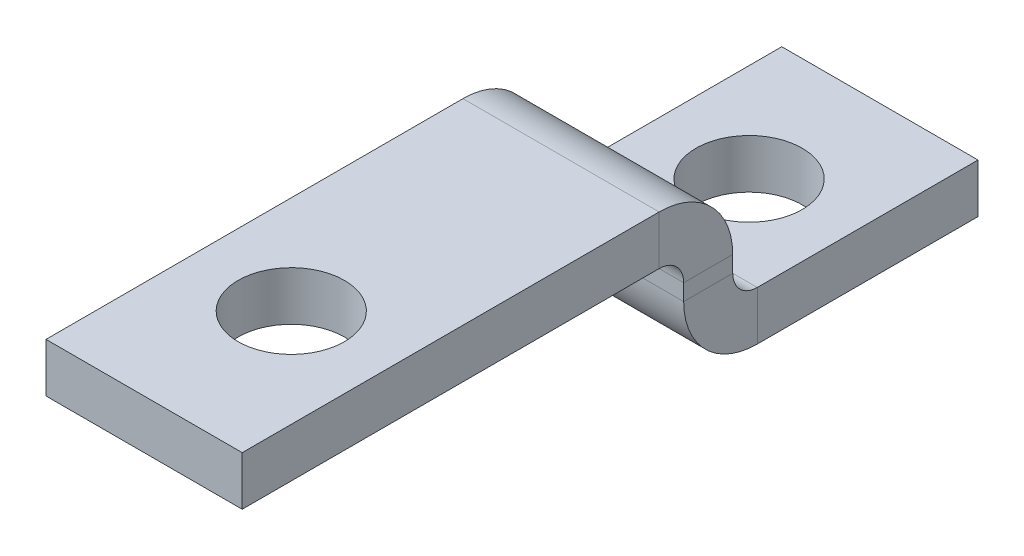
ISO-10303-21;
HEADER;
FILE_DESCRIPTION(('STEP AP214'),'2;1');
FILE_NAME('part.step','',(''),(''),'','','');
FILE_SCHEMA(('AUTOMOTIVE_DESIGN { 1 0 10303 214 1 1 1 1 }'));
ENDSEC;
DATA;
#1=APPLICATION_CONTEXT('core data for automotive mechanical design processes');
#2=APPLICATION_PROTOCOL_DEFINITION('international standard','automotive_design',2000,#1);
#3=PRODUCT_CONTEXT('',#1,'mechanical');
#4=PRODUCT('Part','Part','',(#3));
#5=PRODUCT_RELATED_PRODUCT_CATEGORY('part','',(#4));
#6=PRODUCT_DEFINITION_FORMATION('','',#4);
#7=PRODUCT_DEFINITION_CONTEXT('part definition',#1,'design');
#8=PRODUCT_DEFINITION('design','',#6,#7);
#9=PRODUCT_DEFINITION_SHAPE('','',#8);
#10=(LENGTH_UNIT() NAMED_UNIT(*) SI_UNIT(.MILLI.,.METRE.));
#11=(NAMED_UNIT(*) PLANE_ANGLE_UNIT() SI_UNIT($,.RADIAN.));
#12=(NAMED_UNIT(*) SI_UNIT($,.STERADIAN.) SOLID_ANGLE_UNIT());
#13=UNCERTAINTY_MEASURE_WITH_UNIT(LENGTH_MEASURE(1.E-05),#10,'distance_accuracy_value','');
#14=(GEOMETRIC_REPRESENTATION_CONTEXT(3) GLOBAL_UNCERTAINTY_ASSIGNED_CONTEXT((#13)) GLOBAL_UNIT_ASSIGNED_CONTEXT((#10,
#11,#12)) REPRESENTATION_CONTEXT('',''));
#15=CARTESIAN_POINT('',(0.,0.,0.));
#16=DIRECTION('',(0.,0.,1.));
#17=DIRECTION('',(1.,0.,0.));
#18=AXIS2_PLACEMENT_3D('',#15,#16,#17);
#19=CARTESIAN_POINT('',(-3.,3.5,0.));
#20=DIRECTION('',(1.,0.,0.));
#21=DIRECTION('',(0.,-1.,0.));
#22=AXIS2_PLACEMENT_3D('',#19,#20,#21);
#23=PLANE('',#22);
#24=DIRECTION('',(0.,0.,1.));
#25=VECTOR('',#24,1.);
#26=CARTESIAN_POINT('',(-3.,2.75,0.));
#27=LINE('',#26,#25);
#28=CARTESIAN_POINT('',(-3.,2.75,-1.5));
#29=VERTEX_POINT('',#28);
#30=CARTESIAN_POINT('',(-3.,2.75,0.));
#31=VERTEX_POINT('',#30);
#32=EDGE_CURVE('E11',#29,#31,#27,.T.);
#33=ORIENTED_EDGE('',*,*,#32,.F.);
#34=DIRECTION('',(0.,1.,0.));
#35=VECTOR('',#34,1.);
#36=CARTESIAN_POINT('',(-3.,3.5,-1.5));
#37=LINE('',#36,#35);
#38=CARTESIAN_POINT('',(-3.,2.25,-1.5));
#39=VERTEX_POINT('',#38);
#40=EDGE_CURVE('E96',#29,#39,#37,.F.);
#41=ORIENTED_EDGE('',*,*,#40,.T.);
#42=DIRECTION('',(0.,0.,1.));
#43=VECTOR('',#42,1.);
#44=CARTESIAN_POINT('',(-3.,2.25,0.));
#45=LINE('',#44,#43);
#46=CARTESIAN_POINT('',(-3.,2.25,0.));
#47=VERTEX_POINT('',#46);
#48=EDGE_CURVE('E49',#39,#47,#45,.T.);
#49=ORIENTED_EDGE('',*,*,#48,.T.);
#50=DIRECTION('',(0.,-1.,0.));
#51=VECTOR('',#50,1.);
#52=CARTESIAN_POINT('',(-3.,3.5,0.));
#53=LINE('',#52,#51);
#54=EDGE_CURVE('E98',#31,#47,#53,.T.);
#55=ORIENTED_EDGE('',*,*,#54,.F.);
#56=EDGE_LOOP('',(#33,#41,#49,#55));
#57=FACE_BOUND('',#56,.T.);
#58=ADVANCED_FACE('F39',(#57),#23,.F.);
#59=CARTESIAN_POINT('',(-3.,2.25,-2.25));
#60=DIRECTION('',(1.,0.,0.));
#61=DIRECTION('',(0.,0.,-1.));
#62=AXIS2_PLACEMENT_3D('',#59,#60,#61);
#63=PLANE('',#62);
#64=ORIENTED_EDGE('',*,*,#48,.F.);
#65=CARTESIAN_POINT('',(-3.,2.25,-2.25));
#66=DIRECTION('',(-1.,0.,0.));
#67=DIRECTION('',(0.,0.,1.));
#68=AXIS2_PLACEMENT_3D('',#65,#66,#67);
#69=CIRCLE('',#68,0.75);
#70=CARTESIAN_POINT('',(-3.,1.5,-2.25));
#71=VERTEX_POINT('',#70);
#72=EDGE_CURVE('E138',#39,#71,#69,.F.);
#73=ORIENTED_EDGE('',*,*,#72,.T.);
#74=DIRECTION('',(0.,-1.,0.));
#75=VECTOR('',#74,1.);
#76=CARTESIAN_POINT('',(-3.,0.,-2.25));
#77=LINE('',#76,#75);
#78=CARTESIAN_POINT('',(-3.,0.,-2.25));
#79=VERTEX_POINT('',#78);
#80=EDGE_CURVE('E168',#71,#79,#77,.T.);
#81=ORIENTED_EDGE('',*,*,#80,.T.);
#82=CARTESIAN_POINT('',(-3.,2.25,-2.25));
#83=DIRECTION('',(-1.,0.,0.));
#84=DIRECTION('',(0.,0.,1.));
#85=AXIS2_PLACEMENT_3D('',#82,#83,#84);
#86=CIRCLE('',#85,2.25);
#87=EDGE_CURVE('E177',#47,#79,#86,.F.);
#88=ORIENTED_EDGE('',*,*,#87,.F.);
#89=EDGE_LOOP('',(#64,#73,#81,#88));
#90=FACE_BOUND('',#89,.T.);
#91=ADVANCED_FACE('F176',(#90),#63,.F.);
#92=CARTESIAN_POINT('',(-3.,0.,0.));
#93=DIRECTION('',(1.,0.,0.));
#94=DIRECTION('',(0.,0.,-1.));
#95=AXIS2_PLACEMENT_3D('',#92,#93,#94);
#96=PLANE('',#95);
#97=ORIENTED_EDGE('',*,*,#80,.F.);
#98=DIRECTION('',(0.,0.,1.));
#99=VECTOR('',#98,1.);
#100=CARTESIAN_POINT('',(-3.,1.5,0.));
#101=LINE('',#100,#99);
#102=CARTESIAN_POINT('',(-3.,1.5,-9.));
#103=VERTEX_POINT('',#102);
#104=EDGE_CURVE('E144',#71,#103,#101,.F.);
#105=ORIENTED_EDGE('',*,*,#104,.T.);
#106=DIRECTION('',(0.,-1.,0.));
#107=VECTOR('',#106,1.);
#108=CARTESIAN_POINT('',(-3.,0.,-9.));
#109=LINE('',#108,#107);
#110=CARTESIAN_POINT('',(-3.,0.,-9.));
#111=VERTEX_POINT('',#110);
#112=EDGE_CURVE('E165',#103,#111,#109,.T.);
#113=ORIENTED_EDGE('',*,*,#112,.T.);
#114=DIRECTION('',(0.,0.,-1.));
#115=VECTOR('',#114,1.);
#116=CARTESIAN_POINT('',(-3.,0.,0.));
#117=LINE('',#116,#115);
#118=EDGE_CURVE('E196',#79,#111,#117,.T.);
#119=ORIENTED_EDGE('',*,*,#118,.F.);
#120=EDGE_LOOP('',(#97,#105,#113,#119));
#121=FACE_BOUND('',#120,.T.);
#122=ADVANCED_FACE('F197',(#121),#96,.F.);
#123=CARTESIAN_POINT('',(3.,0.,-9.));
#124=DIRECTION('',(0.,0.,-1.));
#125=DIRECTION('',(-1.,0.,0.));
#126=AXIS2_PLACEMENT_3D('',#123,#124,#125);
#127=PLANE('',#126);
#128=ORIENTED_EDGE('',*,*,#112,.F.);
#129=DIRECTION('',(1.,0.,0.));
#130=VECTOR('',#129,1.);
#131=CARTESIAN_POINT('',(3.,1.5,-9.));
#132=LINE('',#131,#130);
#133=CARTESIAN_POINT('',(3.,1.5,-9.));
#134=VERTEX_POINT('',#133);
#135=EDGE_CURVE('E238',#134,#103,#132,.F.);
#136=ORIENTED_EDGE('',*,*,#135,.F.);
#137=DIRECTION('',(0.,-1.,0.));
#138=VECTOR('',#137,1.);
#139=CARTESIAN_POINT('',(3.,0.,-9.));
#140=LINE('',#139,#138);
#141=CARTESIAN_POINT('',(3.,0.,-9.));
#142=VERTEX_POINT('',#141);
#143=EDGE_CURVE('E162',#134,#142,#140,.T.);
#144=ORIENTED_EDGE('',*,*,#143,.T.);
#145=DIRECTION('',(-1.,0.,0.));
#146=VECTOR('',#145,1.);
#147=CARTESIAN_POINT('',(3.,0.,-9.));
#148=LINE('',#147,#146);
#149=EDGE_CURVE('E201',#142,#111,#148,.T.);
#150=ORIENTED_EDGE('',*,*,#149,.T.);
#151=EDGE_LOOP('',(#128,#136,#144,#150));
#152=FACE_BOUND('',#151,.T.);
#153=ADVANCED_FACE('F249',(#152),#127,.T.);
#154=CARTESIAN_POINT('',(3.,0.,0.));
#155=DIRECTION('',(1.,0.,0.));
#156=DIRECTION('',(0.,0.,-1.));
#157=AXIS2_PLACEMENT_3D('',#154,#155,#156);
#158=PLANE('',#157);
#159=ORIENTED_EDGE('',*,*,#143,.F.);
#160=DIRECTION('',(0.,0.,1.));
#161=VECTOR('',#160,1.);
#162=CARTESIAN_POINT('',(3.,1.5,0.));
#163=LINE('',#162,#161);
#164=CARTESIAN_POINT('',(3.,1.5,-2.25));
#165=VERTEX_POINT('',#164);
#166=EDGE_CURVE('E127',#165,#134,#163,.F.);
#167=ORIENTED_EDGE('',*,*,#166,.F.);
#168=DIRECTION('',(0.,-1.,0.));
#169=VECTOR('',#168,1.);
#170=CARTESIAN_POINT('',(3.,0.,-2.25));
#171=LINE('',#170,#169);
#172=CARTESIAN_POINT('',(3.,0.,-2.25));
#173=VERTEX_POINT('',#172);
#174=EDGE_CURVE('E159',#165,#173,#171,.T.);
#175=ORIENTED_EDGE('',*,*,#174,.T.);
#176=DIRECTION('',(0.,0.,-1.));
#177=VECTOR('',#176,1.);
#178=CARTESIAN_POINT('',(3.,0.,0.));
#179=LINE('',#178,#177);
#180=EDGE_CURVE('E207',#173,#142,#179,.T.);
#181=ORIENTED_EDGE('',*,*,#180,.T.);
#182=EDGE_LOOP('',(#159,#167,#175,#181));
#183=FACE_BOUND('',#182,.T.);
#184=ADVANCED_FACE('F342',(#183),#158,.T.);
#185=CARTESIAN_POINT('',(3.,2.25,-2.25));
#186=DIRECTION('',(-1.,0.,0.));
#187=DIRECTION('',(0.,0.,1.));
#188=AXIS2_PLACEMENT_3D('',#185,#186,#187);
#189=PLANE('',#188);
#190=ORIENTED_EDGE('',*,*,#174,.F.);
#191=CARTESIAN_POINT('',(3.,2.25,-2.25));
#192=DIRECTION('',(-1.,0.,0.));
#193=DIRECTION('',(0.,0.,1.));
#194=AXIS2_PLACEMENT_3D('',#191,#192,#193);
#195=CIRCLE('',#194,0.75);
#196=CARTESIAN_POINT('',(3.,2.25,-1.5));
#197=VERTEX_POINT('',#196);
#198=EDGE_CURVE('E133',#165,#197,#195,.T.);
#199=ORIENTED_EDGE('',*,*,#198,.T.);
#200=DIRECTION('',(0.,0.,1.));
#201=VECTOR('',#200,1.);
#202=CARTESIAN_POINT('',(3.,2.25,0.));
#203=LINE('',#202,#201);
#204=CARTESIAN_POINT('',(3.,2.25,0.));
#205=VERTEX_POINT('',#204);
#206=EDGE_CURVE('E157',#197,#205,#203,.T.);
#207=ORIENTED_EDGE('',*,*,#206,.T.);
#208=CARTESIAN_POINT('',(3.,2.25,-2.25));
#209=DIRECTION('',(1.,0.,0.));
#210=DIRECTION('',(0.,0.,-1.));
#211=AXIS2_PLACEMENT_3D('',#208,#209,#210);
#212=CIRCLE('',#211,2.25);
#213=EDGE_CURVE('E193',#173,#205,#212,.F.);
#214=ORIENTED_EDGE('',*,*,#213,.F.);
#215=EDGE_LOOP('',(#190,#199,#207,#214));
#216=FACE_BOUND('',#215,.T.);
#217=ADVANCED_FACE('F338',(#216),#189,.F.);
#218=CARTESIAN_POINT('',(3.,3.5,0.));
#219=DIRECTION('',(1.,0.,0.));
#220=DIRECTION('',(0.,-1.,0.));
#221=AXIS2_PLACEMENT_3D('',#218,#219,#220);
#222=PLANE('',#221);
#223=ORIENTED_EDGE('',*,*,#206,.F.);
#224=DIRECTION('',(0.,1.,0.));
#225=VECTOR('',#224,1.);
#226=CARTESIAN_POINT('',(3.,3.5,-1.5));
#227=LINE('',#226,#225);
#228=CARTESIAN_POINT('',(3.,2.75,-1.5));
#229=VERTEX_POINT('',#228);
#230=EDGE_CURVE('E126',#229,#197,#227,.F.);
#231=ORIENTED_EDGE('',*,*,#230,.F.);
#232=DIRECTION('',(0.,0.,1.));
#233=VECTOR('',#232,1.);
#234=CARTESIAN_POINT('',(3.,2.75,0.));
#235=LINE('',#234,#233);
#236=CARTESIAN_POINT('',(3.,2.75,0.));
#237=VERTEX_POINT('',#236);
#238=EDGE_CURVE('E154',#229,#237,#235,.T.);
#239=ORIENTED_EDGE('',*,*,#238,.T.);
#240=DIRECTION('',(0.,-1.,0.));
#241=VECTOR('',#240,1.);
#242=CARTESIAN_POINT('',(3.,3.5,0.));
#243=LINE('',#242,#241);
#244=EDGE_CURVE('E257',#237,#205,#243,.T.);
#245=ORIENTED_EDGE('',*,*,#244,.T.);
#246=EDGE_LOOP('',(#223,#231,#239,#245));
#247=FACE_BOUND('',#246,.T.);
#248=ADVANCED_FACE('F334',(#247),#222,.T.);
#249=CARTESIAN_POINT('',(3.,2.75,0.75));
#250=DIRECTION('',(1.,0.,0.));
#251=DIRECTION('',(0.,0.,-1.));
#252=AXIS2_PLACEMENT_3D('',#249,#250,#251);
#253=PLANE('',#252);
#254=ORIENTED_EDGE('',*,*,#238,.F.);
#255=CARTESIAN_POINT('',(3.,2.75,0.75));
#256=DIRECTION('',(1.,0.,0.));
#257=DIRECTION('',(0.,0.,-1.));
#258=AXIS2_PLACEMENT_3D('',#255,#256,#257);
#259=CIRCLE('',#258,2.25);
#260=CARTESIAN_POINT('',(3.,5.,0.75));
#261=VERTEX_POINT('',#260);
#262=EDGE_CURVE('E114',#229,#261,#259,.T.);
#263=ORIENTED_EDGE('',*,*,#262,.T.);
#264=DIRECTION('',(0.,-1.,0.));
#265=VECTOR('',#264,1.);
#266=CARTESIAN_POINT('',(3.,3.5,0.75));
#267=LINE('',#266,#265);
#268=CARTESIAN_POINT('',(3.,3.5,0.75));
#269=VERTEX_POINT('',#268);
#270=EDGE_CURVE('E151',#261,#269,#267,.T.);
#271=ORIENTED_EDGE('',*,*,#270,.T.);
#272=CARTESIAN_POINT('',(3.,2.75,0.75));
#273=DIRECTION('',(-1.,0.,0.));
#274=DIRECTION('',(0.,0.,1.));
#275=AXIS2_PLACEMENT_3D('',#272,#273,#274);
#276=CIRCLE('',#275,0.75);
#277=EDGE_CURVE('E216',#237,#269,#276,.F.);
#278=ORIENTED_EDGE('',*,*,#277,.F.);
#279=EDGE_LOOP('',(#254,#263,#271,#278));
#280=FACE_BOUND('',#279,.T.);
#281=ADVANCED_FACE('F330',(#280),#253,.T.);
#282=CARTESIAN_POINT('',(3.,3.5,0.));
#283=DIRECTION('',(1.,0.,0.));
#284=DIRECTION('',(0.,0.,-1.));
#285=AXIS2_PLACEMENT_3D('',#282,#283,#284);
#286=PLANE('',#285);
#287=ORIENTED_EDGE('',*,*,#270,.F.);
#288=DIRECTION('',(0.,0.,1.));
#289=VECTOR('',#288,1.);
#290=CARTESIAN_POINT('',(3.,5.,0.));
#291=LINE('',#290,#289);
#292=CARTESIAN_POINT('',(3.,5.,13.5));
#293=VERTEX_POINT('',#292);
#294=EDGE_CURVE('E230',#293,#261,#291,.F.);
#295=ORIENTED_EDGE('',*,*,#294,.F.);
#296=DIRECTION('',(0.,-1.,0.));
#297=VECTOR('',#296,1.);
#298=CARTESIAN_POINT('',(3.,3.5,13.5));
#299=LINE('',#298,#297);
#300=CARTESIAN_POINT('',(3.,3.5,13.5));
#301=VERTEX_POINT('',#300);
#302=EDGE_CURVE('E148',#293,#301,#299,.T.);
#303=ORIENTED_EDGE('',*,*,#302,.T.);
#304=DIRECTION('',(0.,0.,-1.));
#305=VECTOR('',#304,1.);
#306=CARTESIAN_POINT('',(3.,3.5,0.));
#307=LINE('',#306,#305);
#308=EDGE_CURVE('E266',#301,#269,#307,.T.);
#309=ORIENTED_EDGE('',*,*,#308,.T.);
#310=EDGE_LOOP('',(#287,#295,#303,#309));
#311=FACE_BOUND('',#310,.T.);
#312=ADVANCED_FACE('F326',(#311),#286,.T.);
#313=CARTESIAN_POINT('',(3.,3.5,13.5));
#314=DIRECTION('',(0.,0.,-1.));
#315=DIRECTION('',(-1.,0.,0.));
#316=AXIS2_PLACEMENT_3D('',#313,#314,#315);
#317=PLANE('',#316);
#318=ORIENTED_EDGE('',*,*,#302,.F.);
#319=DIRECTION('',(1.,0.,0.));
#320=VECTOR('',#319,1.);
#321=CARTESIAN_POINT('',(3.,5.,13.5));
#322=LINE('',#321,#320);
#323=CARTESIAN_POINT('',(-3.,5.,13.5));
#324=VERTEX_POINT('',#323);
#325=EDGE_CURVE('E119',#293,#324,#322,.F.);
#326=ORIENTED_EDGE('',*,*,#325,.T.);
#327=DIRECTION('',(0.,-1.,0.));
#328=VECTOR('',#327,1.);
#329=CARTESIAN_POINT('',(-3.,3.5,13.5));
#330=LINE('',#329,#328);
#331=CARTESIAN_POINT('',(-3.,3.5,13.5));
#332=VERTEX_POINT('',#331);
#333=EDGE_CURVE('E145',#324,#332,#330,.T.);
#334=ORIENTED_EDGE('',*,*,#333,.T.);
#335=DIRECTION('',(-1.,0.,0.));
#336=VECTOR('',#335,1.);
#337=CARTESIAN_POINT('',(3.,3.5,13.5));
#338=LINE('',#337,#336);
#339=EDGE_CURVE('E269',#301,#332,#338,.T.);
#340=ORIENTED_EDGE('',*,*,#339,.F.);
#341=EDGE_LOOP('',(#318,#326,#334,#340));
#342=FACE_BOUND('',#341,.T.);
#343=ADVANCED_FACE('F322',(#342),#317,.F.);
#344=CARTESIAN_POINT('',(-3.,3.5,0.));
#345=DIRECTION('',(1.,0.,0.));
#346=DIRECTION('',(0.,0.,-1.));
#347=AXIS2_PLACEMENT_3D('',#344,#345,#346);
#348=PLANE('',#347);
#349=ORIENTED_EDGE('',*,*,#333,.F.);
#350=DIRECTION('',(0.,0.,1.));
#351=VECTOR('',#350,1.);
#352=CARTESIAN_POINT('',(-3.,5.,0.));
#353=LINE('',#352,#351);
#354=CARTESIAN_POINT('',(-3.,5.,0.75));
#355=VERTEX_POINT('',#354);
#356=EDGE_CURVE('E228',#324,#355,#353,.F.);
#357=ORIENTED_EDGE('',*,*,#356,.T.);
#358=DIRECTION('',(0.,-1.,0.));
#359=VECTOR('',#358,1.);
#360=CARTESIAN_POINT('',(-3.,3.5,0.75));
#361=LINE('',#360,#359);
#362=CARTESIAN_POINT('',(-3.,3.5,0.75));
#363=VERTEX_POINT('',#362);
#364=EDGE_CURVE('E43',#355,#363,#361,.T.);
#365=ORIENTED_EDGE('',*,*,#364,.T.);
#366=DIRECTION('',(0.,0.,-1.));
#367=VECTOR('',#366,1.);
#368=CARTESIAN_POINT('',(-3.,3.5,0.));
#369=LINE('',#368,#367);
#370=EDGE_CURVE('E263',#332,#363,#369,.T.);
#371=ORIENTED_EDGE('',*,*,#370,.F.);
#372=EDGE_LOOP('',(#349,#357,#365,#371));
#373=FACE_BOUND('',#372,.T.);
#374=ADVANCED_FACE('F284',(#373),#348,.F.);
#375=CARTESIAN_POINT('',(0.,0.,-5.));
#376=DIRECTION('',(0.,1.,0.));
#377=DIRECTION('',(0.,0.,1.));
#378=AXIS2_PLACEMENT_3D('',#375,#376,#377);
#379=CYLINDRICAL_SURFACE('',#378,1.625);
#380=CARTESIAN_POINT('',(0.,0.,-5.));
#381=DIRECTION('',(0.,1.,0.));
#382=DIRECTION('',(0.,0.,1.));
#383=AXIS2_PLACEMENT_3D('',#380,#381,#382);
#384=CIRCLE('',#383,1.625);
#385=CARTESIAN_POINT('',(0.,0.,-3.375));
#386=VERTEX_POINT('',#385);
#387=EDGE_CURVE('E202',#386,#386,#384,.T.);
#388=ORIENTED_EDGE('',*,*,#387,.F.);
#389=EDGE_LOOP('',(#388));
#390=FACE_BOUND('',#389,.T.);
#391=CARTESIAN_POINT('',(0.,1.5,-5.));
#392=DIRECTION('',(0.,1.,0.));
#393=DIRECTION('',(0.,0.,1.));
#394=AXIS2_PLACEMENT_3D('',#391,#392,#393);
#395=CIRCLE('',#394,1.625);
#396=CARTESIAN_POINT('',(0.,1.5,-3.375));
#397=VERTEX_POINT('',#396);
#398=EDGE_CURVE('E135',#397,#397,#395,.T.);
#399=ORIENTED_EDGE('',*,*,#398,.T.);
#400=EDGE_LOOP('',(#399));
#401=FACE_BOUND('',#400,.T.);
#402=ADVANCED_FACE('F41',(#390,#401),#379,.F.);
#403=CARTESIAN_POINT('',(0.,3.5,9.));
#404=DIRECTION('',(0.,1.,0.));
#405=DIRECTION('',(0.,0.,1.));
#406=AXIS2_PLACEMENT_3D('',#403,#404,#405);
#407=CYLINDRICAL_SURFACE('',#406,1.625);
#408=CARTESIAN_POINT('',(0.,3.5,9.));
#409=DIRECTION('',(0.,-1.,0.));
#410=DIRECTION('',(0.,0.,-1.));
#411=AXIS2_PLACEMENT_3D('',#408,#409,#410);
#412=CIRCLE('',#411,1.625);
#413=CARTESIAN_POINT('',(0.,3.5,7.375));
#414=VERTEX_POINT('',#413);
#415=EDGE_CURVE('E260',#414,#414,#412,.T.);
#416=ORIENTED_EDGE('',*,*,#415,.T.);
#417=EDGE_LOOP('',(#416));
#418=FACE_BOUND('',#417,.T.);
#419=CARTESIAN_POINT('',(0.,5.,9.));
#420=DIRECTION('',(0.,-1.,0.));
#421=DIRECTION('',(0.,0.,-1.));
#422=AXIS2_PLACEMENT_3D('',#419,#420,#421);
#423=CIRCLE('',#422,1.625);
#424=CARTESIAN_POINT('',(0.,5.,7.375));
#425=VERTEX_POINT('',#424);
#426=EDGE_CURVE('E225',#425,#425,#423,.T.);
#427=ORIENTED_EDGE('',*,*,#426,.F.);
#428=EDGE_LOOP('',(#427));
#429=FACE_BOUND('',#428,.T.);
#430=ADVANCED_FACE('F283',(#418,#429),#407,.F.);
#431=CARTESIAN_POINT('',(-3.,2.75,0.75));
#432=DIRECTION('',(-1.,0.,0.));
#433=DIRECTION('',(0.,0.,1.));
#434=AXIS2_PLACEMENT_3D('',#431,#432,#433);
#435=PLANE('',#434);
#436=CARTESIAN_POINT('',(-3.,2.75,0.75));
#437=DIRECTION('',(1.,0.,0.));
#438=DIRECTION('',(0.,0.,-1.));
#439=AXIS2_PLACEMENT_3D('',#436,#437,#438);
#440=CIRCLE('',#439,2.25);
#441=EDGE_CURVE('E111',#355,#29,#440,.F.);
#442=ORIENTED_EDGE('',*,*,#441,.T.);
#443=ORIENTED_EDGE('',*,*,#32,.T.);
#444=CARTESIAN_POINT('',(-3.,2.75,0.75));
#445=DIRECTION('',(1.,0.,0.));
#446=DIRECTION('',(0.,0.,-1.));
#447=AXIS2_PLACEMENT_3D('',#444,#445,#446);
#448=CIRCLE('',#447,0.75);
#449=EDGE_CURVE('E220',#363,#31,#448,.F.);
#450=ORIENTED_EDGE('',*,*,#449,.F.);
#451=ORIENTED_EDGE('',*,*,#364,.F.);
#452=EDGE_LOOP('',(#442,#443,#450,#451));
#453=FACE_BOUND('',#452,.T.);
#454=ADVANCED_FACE('F130',(#453),#435,.T.);
#455=CARTESIAN_POINT('',(3.,3.5,0.));
#456=DIRECTION('',(0.,1.,0.));
#457=DIRECTION('',(0.,0.,1.));
#458=AXIS2_PLACEMENT_3D('',#455,#456,#457);
#459=PLANE('',#458);
#460=ORIENTED_EDGE('',*,*,#415,.F.);
#461=EDGE_LOOP('',(#460));
#462=FACE_BOUND('',#461,.T.);
#463=ORIENTED_EDGE('',*,*,#370,.T.);
#464=DIRECTION('',(-1.,0.,0.));
#465=VECTOR('',#464,1.);
#466=CARTESIAN_POINT('',(3.,3.5,0.75));
#467=LINE('',#466,#465);
#468=EDGE_CURVE('E209',#363,#269,#467,.F.);
#469=ORIENTED_EDGE('',*,*,#468,.T.);
#470=ORIENTED_EDGE('',*,*,#308,.F.);
#471=ORIENTED_EDGE('',*,*,#339,.T.);
#472=EDGE_LOOP('',(#463,#469,#470,#471));
#473=FACE_BOUND('',#472,.T.);
#474=ADVANCED_FACE('F305',(#462,#473),#459,.F.);
#475=CARTESIAN_POINT('',(3.,3.5,0.));
#476=DIRECTION('',(0.,0.,-1.));
#477=DIRECTION('',(0.,1.,0.));
#478=AXIS2_PLACEMENT_3D('',#475,#476,#477);
#479=PLANE('',#478);
#480=ORIENTED_EDGE('',*,*,#54,.T.);
#481=DIRECTION('',(-1.,0.,0.));
#482=VECTOR('',#481,1.);
#483=CARTESIAN_POINT('',(3.,2.25,0.));
#484=LINE('',#483,#482);
#485=EDGE_CURVE('E192',#47,#205,#484,.F.);
#486=ORIENTED_EDGE('',*,*,#485,.T.);
#487=ORIENTED_EDGE('',*,*,#244,.F.);
#488=DIRECTION('',(-1.,0.,0.));
#489=VECTOR('',#488,1.);
#490=CARTESIAN_POINT('',(-3.,2.75,0.));
#491=LINE('',#490,#489);
#492=EDGE_CURVE('E213',#237,#31,#491,.T.);
#493=ORIENTED_EDGE('',*,*,#492,.T.);
#494=EDGE_LOOP('',(#480,#486,#487,#493));
#495=FACE_BOUND('',#494,.T.);
#496=ADVANCED_FACE('F310',(#495),#479,.F.);
#497=CARTESIAN_POINT('',(3.,0.,0.));
#498=DIRECTION('',(0.,1.,0.));
#499=DIRECTION('',(0.,0.,1.));
#500=AXIS2_PLACEMENT_3D('',#497,#498,#499);
#501=PLANE('',#500);
#502=ORIENTED_EDGE('',*,*,#387,.T.);
#503=EDGE_LOOP('',(#502));
#504=FACE_BOUND('',#503,.T.);
#505=ORIENTED_EDGE('',*,*,#180,.F.);
#506=DIRECTION('',(-1.,0.,0.));
#507=VECTOR('',#506,1.);
#508=CARTESIAN_POINT('',(3.,0.,-2.25));
#509=LINE('',#508,#507);
#510=EDGE_CURVE('E190',#173,#79,#509,.T.);
#511=ORIENTED_EDGE('',*,*,#510,.T.);
#512=ORIENTED_EDGE('',*,*,#118,.T.);
#513=ORIENTED_EDGE('',*,*,#149,.F.);
#514=EDGE_LOOP('',(#505,#511,#512,#513));
#515=FACE_BOUND('',#514,.T.);
#516=ADVANCED_FACE('F205',(#504,#515),#501,.F.);
#517=CARTESIAN_POINT('',(3.,2.75,0.75));
#518=DIRECTION('',(1.,0.,0.));
#519=DIRECTION('',(0.,0.,-1.));
#520=AXIS2_PLACEMENT_3D('',#517,#518,#519);
#521=CYLINDRICAL_SURFACE('',#520,0.75);
#522=ORIENTED_EDGE('',*,*,#277,.T.);
#523=ORIENTED_EDGE('',*,*,#468,.F.);
#524=ORIENTED_EDGE('',*,*,#449,.T.);
#525=ORIENTED_EDGE('',*,*,#492,.F.);
#526=EDGE_LOOP('',(#522,#523,#524,#525));
#527=FACE_BOUND('',#526,.T.);
#528=ADVANCED_FACE('F426',(#527),#521,.F.);
#529=CARTESIAN_POINT('',(3.,2.25,-2.25));
#530=DIRECTION('',(-1.,0.,0.));
#531=DIRECTION('',(0.,0.,1.));
#532=AXIS2_PLACEMENT_3D('',#529,#530,#531);
#533=CYLINDRICAL_SURFACE('',#532,2.25);
#534=ORIENTED_EDGE('',*,*,#213,.T.);
#535=ORIENTED_EDGE('',*,*,#485,.F.);
#536=ORIENTED_EDGE('',*,*,#87,.T.);
#537=ORIENTED_EDGE('',*,*,#510,.F.);
#538=EDGE_LOOP('',(#534,#535,#536,#537));
#539=FACE_BOUND('',#538,.T.);
#540=ADVANCED_FACE('F188',(#539),#533,.T.);
#541=CARTESIAN_POINT('',(3.,5.,0.));
#542=DIRECTION('',(0.,1.,0.));
#543=DIRECTION('',(0.,0.,1.));
#544=AXIS2_PLACEMENT_3D('',#541,#542,#543);
#545=PLANE('',#544);
#546=ORIENTED_EDGE('',*,*,#426,.T.);
#547=EDGE_LOOP('',(#546));
#548=FACE_BOUND('',#547,.T.);
#549=ORIENTED_EDGE('',*,*,#356,.F.);
#550=ORIENTED_EDGE('',*,*,#325,.F.);
#551=ORIENTED_EDGE('',*,*,#294,.T.);
#552=DIRECTION('',(1.,0.,0.));
#553=VECTOR('',#552,1.);
#554=CARTESIAN_POINT('',(3.,5.,0.75));
#555=LINE('',#554,#553);
#556=EDGE_CURVE('E118',#355,#261,#555,.T.);
#557=ORIENTED_EDGE('',*,*,#556,.F.);
#558=EDGE_LOOP('',(#549,#550,#551,#557));
#559=FACE_BOUND('',#558,.T.);
#560=ADVANCED_FACE('F295',(#548,#559),#545,.T.);
#561=CARTESIAN_POINT('',(3.,3.5,-1.5));
#562=DIRECTION('',(0.,0.,-1.));
#563=DIRECTION('',(0.,1.,0.));
#564=AXIS2_PLACEMENT_3D('',#561,#562,#563);
#565=PLANE('',#564);
#566=ORIENTED_EDGE('',*,*,#40,.F.);
#567=DIRECTION('',(1.,0.,0.));
#568=VECTOR('',#567,1.);
#569=CARTESIAN_POINT('',(3.,2.75,-1.5));
#570=LINE('',#569,#568);
#571=EDGE_CURVE('E108',#229,#29,#570,.F.);
#572=ORIENTED_EDGE('',*,*,#571,.F.);
#573=ORIENTED_EDGE('',*,*,#230,.T.);
#574=DIRECTION('',(1.,0.,0.));
#575=VECTOR('',#574,1.);
#576=CARTESIAN_POINT('',(3.,2.25,-1.5));
#577=LINE('',#576,#575);
#578=EDGE_CURVE('E124',#39,#197,#577,.T.);
#579=ORIENTED_EDGE('',*,*,#578,.F.);
#580=EDGE_LOOP('',(#566,#572,#573,#579));
#581=FACE_BOUND('',#580,.T.);
#582=ADVANCED_FACE('F122',(#581),#565,.T.);
#583=CARTESIAN_POINT('',(3.,1.5,0.));
#584=DIRECTION('',(0.,1.,0.));
#585=DIRECTION('',(0.,0.,1.));
#586=AXIS2_PLACEMENT_3D('',#583,#584,#585);
#587=PLANE('',#586);
#588=ORIENTED_EDGE('',*,*,#398,.F.);
#589=EDGE_LOOP('',(#588));
#590=FACE_BOUND('',#589,.T.);
#591=ORIENTED_EDGE('',*,*,#166,.T.);
#592=ORIENTED_EDGE('',*,*,#135,.T.);
#593=ORIENTED_EDGE('',*,*,#104,.F.);
#594=DIRECTION('',(1.,0.,0.));
#595=VECTOR('',#594,1.);
#596=CARTESIAN_POINT('',(3.,1.5,-2.25));
#597=LINE('',#596,#595);
#598=EDGE_CURVE('E221',#165,#71,#597,.F.);
#599=ORIENTED_EDGE('',*,*,#598,.F.);
#600=EDGE_LOOP('',(#591,#592,#593,#599));
#601=FACE_BOUND('',#600,.T.);
#602=ADVANCED_FACE('F244',(#590,#601),#587,.T.);
#603=CARTESIAN_POINT('',(3.,2.75,0.75));
#604=DIRECTION('',(1.,0.,0.));
#605=DIRECTION('',(0.,0.,-1.));
#606=AXIS2_PLACEMENT_3D('',#603,#604,#605);
#607=CYLINDRICAL_SURFACE('',#606,2.25);
#608=ORIENTED_EDGE('',*,*,#262,.F.);
#609=ORIENTED_EDGE('',*,*,#571,.T.);
#610=ORIENTED_EDGE('',*,*,#441,.F.);
#611=ORIENTED_EDGE('',*,*,#556,.T.);
#612=EDGE_LOOP('',(#608,#609,#610,#611));
#613=FACE_BOUND('',#612,.T.);
#614=ADVANCED_FACE('F109',(#613),#607,.T.);
#615=CARTESIAN_POINT('',(3.,2.25,-2.25));
#616=DIRECTION('',(-1.,0.,0.));
#617=DIRECTION('',(0.,0.,1.));
#618=AXIS2_PLACEMENT_3D('',#615,#616,#617);
#619=CYLINDRICAL_SURFACE('',#618,0.75);
#620=ORIENTED_EDGE('',*,*,#198,.F.);
#621=ORIENTED_EDGE('',*,*,#598,.T.);
#622=ORIENTED_EDGE('',*,*,#72,.F.);
#623=ORIENTED_EDGE('',*,*,#578,.T.);
#624=EDGE_LOOP('',(#620,#621,#622,#623));
#625=FACE_BOUND('',#624,.T.);
#626=ADVANCED_FACE('F293',(#625),#619,.F.);
#627=CLOSED_SHELL('',(#58,#91,#122,#153,#184,#217,#248,#281,#312,#343,#374,#402,#430,#454,#474,
#496,#516,#528,#540,#560,#582,#602,#614,#626));
#628=MANIFOLD_SOLID_BREP('B2',#627);
#629=ADVANCED_BREP_SHAPE_REPRESENTATION('',(#18,#628),#14);
#630=SHAPE_DEFINITION_REPRESENTATION(#9,#629);
ENDSEC;
END-ISO-10303-21;
